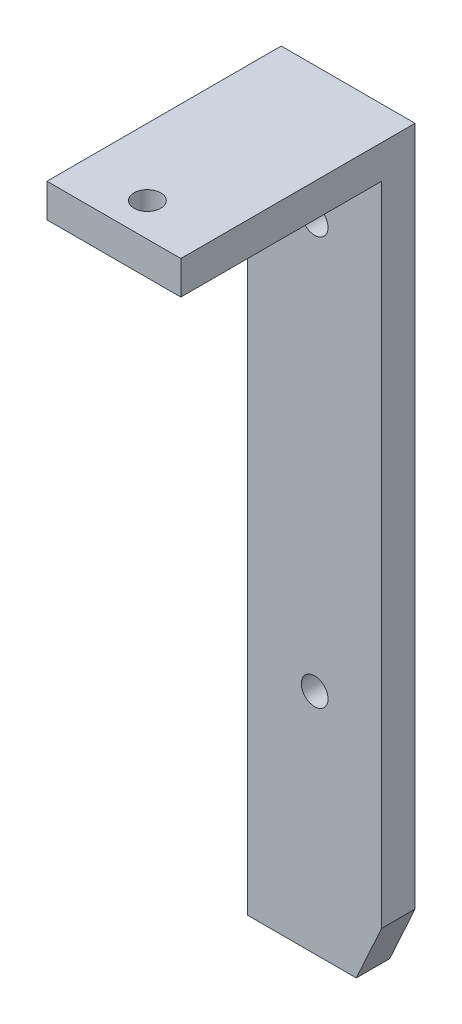
ISO-10303-21;
HEADER;
FILE_DESCRIPTION(('STEP AP214'),'2;1');
FILE_NAME('part.step','',(''),(''),'','','');
FILE_SCHEMA(('AUTOMOTIVE_DESIGN { 1 0 10303 214 1 1 1 1 }'));
ENDSEC;
DATA;
#1=APPLICATION_CONTEXT('core data for automotive mechanical design processes');
#2=APPLICATION_PROTOCOL_DEFINITION('international standard','automotive_design',2000,#1);
#3=PRODUCT_CONTEXT('',#1,'mechanical');
#4=PRODUCT('Part','Part','',(#3));
#5=PRODUCT_RELATED_PRODUCT_CATEGORY('part','',(#4));
#6=PRODUCT_DEFINITION_FORMATION('','',#4);
#7=PRODUCT_DEFINITION_CONTEXT('part definition',#1,'design');
#8=PRODUCT_DEFINITION('design','',#6,#7);
#9=PRODUCT_DEFINITION_SHAPE('','',#8);
#10=(LENGTH_UNIT() NAMED_UNIT(*) SI_UNIT(.MILLI.,.METRE.));
#11=(NAMED_UNIT(*) PLANE_ANGLE_UNIT() SI_UNIT($,.RADIAN.));
#12=(NAMED_UNIT(*) SI_UNIT($,.STERADIAN.) SOLID_ANGLE_UNIT());
#13=UNCERTAINTY_MEASURE_WITH_UNIT(LENGTH_MEASURE(1.E-05),#10,'distance_accuracy_value','');
#14=(GEOMETRIC_REPRESENTATION_CONTEXT(3) GLOBAL_UNCERTAINTY_ASSIGNED_CONTEXT((#13)) GLOBAL_UNIT_ASSIGNED_CONTEXT((#10,
#11,#12)) REPRESENTATION_CONTEXT('',''));
#15=CARTESIAN_POINT('',(0.,0.,0.));
#16=DIRECTION('',(0.,0.,1.));
#17=DIRECTION('',(1.,0.,0.));
#18=AXIS2_PLACEMENT_3D('',#15,#16,#17);
#19=CARTESIAN_POINT('',(6.35,69.85,1.5875));
#20=DIRECTION('',(0.,0.,-1.));
#21=DIRECTION('',(-1.,0.,0.));
#22=AXIS2_PLACEMENT_3D('',#19,#20,#21);
#23=PLANE('',#22);
#24=CARTESIAN_POINT('',(0.,21.59,1.5875));
#25=DIRECTION('',(0.,0.,1.));
#26=DIRECTION('',(1.,0.,0.));
#27=AXIS2_PLACEMENT_3D('',#24,#25,#26);
#28=CIRCLE('',#27,1.27);
#29=CARTESIAN_POINT('',(1.27000000000001,21.59,1.5875));
#30=VERTEX_POINT('',#29);
#31=EDGE_CURVE('E160',#30,#30,#28,.T.);
#32=ORIENTED_EDGE('',*,*,#31,.F.);
#33=EDGE_LOOP('',(#32));
#34=FACE_BOUND('',#33,.T.);
#35=CARTESIAN_POINT('',(0.,60.325,1.5875));
#36=DIRECTION('',(0.,0.,1.));
#37=DIRECTION('',(1.,0.,0.));
#38=AXIS2_PLACEMENT_3D('',#35,#36,#37);
#39=CIRCLE('',#38,1.27);
#40=CARTESIAN_POINT('',(1.27,60.325,1.5875));
#41=VERTEX_POINT('',#40);
#42=EDGE_CURVE('E154',#41,#41,#39,.T.);
#43=ORIENTED_EDGE('',*,*,#42,.F.);
#44=EDGE_LOOP('',(#43));
#45=FACE_BOUND('',#44,.T.);
#46=DIRECTION('',(1.,0.,0.));
#47=VECTOR('',#46,1.);
#48=CARTESIAN_POINT('',(6.35,0.,1.5875));
#49=LINE('',#48,#47);
#50=CARTESIAN_POINT('',(-6.35,0.,1.5875));
#51=VERTEX_POINT('',#50);
#52=CARTESIAN_POINT('',(3.95148272282649,0.,1.5875));
#53=VERTEX_POINT('',#52);
#54=EDGE_CURVE('E120',#51,#53,#49,.T.);
#55=ORIENTED_EDGE('',*,*,#54,.T.);
#56=DIRECTION('',(-0.414132590750487,-0.910216566141426,0.));
#57=VECTOR('',#56,1.);
#58=CARTESIAN_POINT('',(3.95148272282649,0.,1.5875));
#59=LINE('',#58,#57);
#60=CARTESIAN_POINT('',(6.35,5.27166952956644,1.5875));
#61=VERTEX_POINT('',#60);
#62=EDGE_CURVE('E51',#61,#53,#59,.T.);
#63=ORIENTED_EDGE('',*,*,#62,.F.);
#64=DIRECTION('',(0.,-1.,0.));
#65=VECTOR('',#64,1.);
#66=CARTESIAN_POINT('',(6.35,69.85,1.5875));
#67=LINE('',#66,#65);
#68=CARTESIAN_POINT('',(6.35,66.675,1.5875));
#69=VERTEX_POINT('',#68);
#70=EDGE_CURVE('E44',#69,#61,#67,.T.);
#71=ORIENTED_EDGE('',*,*,#70,.F.);
#72=DIRECTION('',(1.,0.,0.));
#73=VECTOR('',#72,1.);
#74=CARTESIAN_POINT('',(-6.35,66.675,1.5875));
#75=LINE('',#74,#73);
#76=CARTESIAN_POINT('',(-6.35,66.675,1.5875));
#77=VERTEX_POINT('',#76);
#78=EDGE_CURVE('E58',#77,#69,#75,.T.);
#79=ORIENTED_EDGE('',*,*,#78,.F.);
#80=DIRECTION('',(0.,-1.,0.));
#81=VECTOR('',#80,1.);
#82=CARTESIAN_POINT('',(-6.35,69.85,1.5875));
#83=LINE('',#82,#81);
#84=EDGE_CURVE('E11',#77,#51,#83,.T.);
#85=ORIENTED_EDGE('',*,*,#84,.T.);
#86=EDGE_LOOP('',(#55,#63,#71,#79,#85));
#87=FACE_BOUND('',#86,.T.);
#88=ADVANCED_FACE('F36',(#34,#45,#87),#23,.F.);
#89=CARTESIAN_POINT('',(-6.35,69.85,1.5875));
#90=DIRECTION('',(1.,0.,0.));
#91=DIRECTION('',(0.,0.,-1.));
#92=AXIS2_PLACEMENT_3D('',#89,#90,#91);
#93=PLANE('',#92);
#94=DIRECTION('',(0.,0.,1.));
#95=VECTOR('',#94,1.);
#96=CARTESIAN_POINT('',(-6.35,0.,1.5875));
#97=LINE('',#96,#95);
#98=CARTESIAN_POINT('',(-6.35,0.,-1.5875));
#99=VERTEX_POINT('',#98);
#100=EDGE_CURVE('E123',#99,#51,#97,.T.);
#101=ORIENTED_EDGE('',*,*,#100,.T.);
#102=ORIENTED_EDGE('',*,*,#84,.F.);
#103=DIRECTION('',(0.,0.,-1.));
#104=VECTOR('',#103,1.);
#105=CARTESIAN_POINT('',(-6.35,66.675,20.6375));
#106=LINE('',#105,#104);
#107=CARTESIAN_POINT('',(-6.35,66.675,20.6375));
#108=VERTEX_POINT('',#107);
#109=EDGE_CURVE('E126',#108,#77,#106,.T.);
#110=ORIENTED_EDGE('',*,*,#109,.F.);
#111=DIRECTION('',(0.,-1.,0.));
#112=VECTOR('',#111,1.);
#113=CARTESIAN_POINT('',(-6.35,69.85,20.6375));
#114=LINE('',#113,#112);
#115=CARTESIAN_POINT('',(-6.35,69.85,20.6375));
#116=VERTEX_POINT('',#115);
#117=EDGE_CURVE('E137',#116,#108,#114,.T.);
#118=ORIENTED_EDGE('',*,*,#117,.F.);
#119=DIRECTION('',(0.,0.,1.));
#120=VECTOR('',#119,1.);
#121=CARTESIAN_POINT('',(-6.35,69.85,1.5875));
#122=LINE('',#121,#120);
#123=CARTESIAN_POINT('',(-6.35,69.85,-1.5875));
#124=VERTEX_POINT('',#123);
#125=EDGE_CURVE('E119',#124,#116,#122,.T.);
#126=ORIENTED_EDGE('',*,*,#125,.F.);
#127=DIRECTION('',(0.,-1.,0.));
#128=VECTOR('',#127,1.);
#129=CARTESIAN_POINT('',(-6.35,69.85,-1.5875));
#130=LINE('',#129,#128);
#131=EDGE_CURVE('E112',#124,#99,#130,.T.);
#132=ORIENTED_EDGE('',*,*,#131,.T.);
#133=EDGE_LOOP('',(#101,#102,#110,#118,#126,#132));
#134=FACE_BOUND('',#133,.T.);
#135=ADVANCED_FACE('F38',(#134),#93,.F.);
#136=CARTESIAN_POINT('',(6.35,69.85,1.5875));
#137=DIRECTION('',(-1.,0.,0.));
#138=DIRECTION('',(0.,0.,1.));
#139=AXIS2_PLACEMENT_3D('',#136,#137,#138);
#140=PLANE('',#139);
#141=ORIENTED_EDGE('',*,*,#70,.T.);
#142=DIRECTION('',(0.,0.,1.));
#143=VECTOR('',#142,1.);
#144=CARTESIAN_POINT('',(6.35,5.27166952956644,-1.5875));
#145=LINE('',#144,#143);
#146=CARTESIAN_POINT('',(6.35,5.27166952956644,-1.5875));
#147=VERTEX_POINT('',#146);
#148=EDGE_CURVE('E95',#147,#61,#145,.T.);
#149=ORIENTED_EDGE('',*,*,#148,.F.);
#150=DIRECTION('',(0.,-1.,0.));
#151=VECTOR('',#150,1.);
#152=CARTESIAN_POINT('',(6.35,69.85,-1.5875));
#153=LINE('',#152,#151);
#154=CARTESIAN_POINT('',(6.35,69.85,-1.5875));
#155=VERTEX_POINT('',#154);
#156=EDGE_CURVE('E105',#155,#147,#153,.T.);
#157=ORIENTED_EDGE('',*,*,#156,.F.);
#158=DIRECTION('',(0.,0.,-1.));
#159=VECTOR('',#158,1.);
#160=CARTESIAN_POINT('',(6.35,69.85,1.5875));
#161=LINE('',#160,#159);
#162=CARTESIAN_POINT('',(6.35,69.85,20.6375));
#163=VERTEX_POINT('',#162);
#164=EDGE_CURVE('E128',#163,#155,#161,.T.);
#165=ORIENTED_EDGE('',*,*,#164,.F.);
#166=DIRECTION('',(0.,1.,0.));
#167=VECTOR('',#166,1.);
#168=CARTESIAN_POINT('',(6.35,69.85,20.6375));
#169=LINE('',#168,#167);
#170=CARTESIAN_POINT('',(6.35,66.675,20.6375));
#171=VERTEX_POINT('',#170);
#172=EDGE_CURVE('E141',#171,#163,#169,.T.);
#173=ORIENTED_EDGE('',*,*,#172,.F.);
#174=DIRECTION('',(0.,0.,-1.));
#175=VECTOR('',#174,1.);
#176=CARTESIAN_POINT('',(6.35,66.675,20.6375));
#177=LINE('',#176,#175);
#178=EDGE_CURVE('E133',#171,#69,#177,.T.);
#179=ORIENTED_EDGE('',*,*,#178,.T.);
#180=EDGE_LOOP('',(#141,#149,#157,#165,#173,#179));
#181=FACE_BOUND('',#180,.T.);
#182=ADVANCED_FACE('F104',(#181),#140,.F.);
#183=CARTESIAN_POINT('',(6.35,69.85,-1.5875));
#184=DIRECTION('',(0.,0.,1.));
#185=DIRECTION('',(1.,0.,0.));
#186=AXIS2_PLACEMENT_3D('',#183,#184,#185);
#187=PLANE('',#186);
#188=CARTESIAN_POINT('',(0.,21.59,-1.5875));
#189=DIRECTION('',(0.,0.,1.));
#190=DIRECTION('',(1.,0.,0.));
#191=AXIS2_PLACEMENT_3D('',#188,#189,#190);
#192=CIRCLE('',#191,1.27);
#193=CARTESIAN_POINT('',(1.27000000000001,21.59,-1.5875));
#194=VERTEX_POINT('',#193);
#195=EDGE_CURVE('E151',#194,#194,#192,.T.);
#196=ORIENTED_EDGE('',*,*,#195,.T.);
#197=EDGE_LOOP('',(#196));
#198=FACE_BOUND('',#197,.T.);
#199=CARTESIAN_POINT('',(0.,60.325,-1.5875));
#200=DIRECTION('',(0.,0.,1.));
#201=DIRECTION('',(1.,0.,0.));
#202=AXIS2_PLACEMENT_3D('',#199,#200,#201);
#203=CIRCLE('',#202,1.27);
#204=CARTESIAN_POINT('',(1.27,60.325,-1.5875));
#205=VERTEX_POINT('',#204);
#206=EDGE_CURVE('E157',#205,#205,#203,.T.);
#207=ORIENTED_EDGE('',*,*,#206,.T.);
#208=EDGE_LOOP('',(#207));
#209=FACE_BOUND('',#208,.T.);
#210=ORIENTED_EDGE('',*,*,#156,.T.);
#211=DIRECTION('',(-0.414132590750487,-0.910216566141426,0.));
#212=VECTOR('',#211,1.);
#213=CARTESIAN_POINT('',(3.95148272282649,0.,-1.5875));
#214=LINE('',#213,#212);
#215=CARTESIAN_POINT('',(3.95148272282649,0.,-1.5875));
#216=VERTEX_POINT('',#215);
#217=EDGE_CURVE('E92',#147,#216,#214,.T.);
#218=ORIENTED_EDGE('',*,*,#217,.T.);
#219=DIRECTION('',(-1.,0.,0.));
#220=VECTOR('',#219,1.);
#221=CARTESIAN_POINT('',(6.35,0.,-1.5875));
#222=LINE('',#221,#220);
#223=EDGE_CURVE('E117',#216,#99,#222,.T.);
#224=ORIENTED_EDGE('',*,*,#223,.T.);
#225=ORIENTED_EDGE('',*,*,#131,.F.);
#226=DIRECTION('',(-1.,0.,0.));
#227=VECTOR('',#226,1.);
#228=CARTESIAN_POINT('',(6.35,69.85,-1.5875));
#229=LINE('',#228,#227);
#230=EDGE_CURVE('E111',#155,#124,#229,.T.);
#231=ORIENTED_EDGE('',*,*,#230,.F.);
#232=EDGE_LOOP('',(#210,#218,#224,#225,#231));
#233=FACE_BOUND('',#232,.T.);
#234=ADVANCED_FACE('F109',(#198,#209,#233),#187,.F.);
#235=CARTESIAN_POINT('',(0.,69.85,0.));
#236=DIRECTION('',(0.,1.,0.));
#237=DIRECTION('',(0.,0.,1.));
#238=AXIS2_PLACEMENT_3D('',#235,#236,#237);
#239=PLANE('',#238);
#240=CARTESIAN_POINT('',(0.,69.85,17.4625));
#241=DIRECTION('',(0.,-1.,0.));
#242=DIRECTION('',(0.,0.,-1.));
#243=AXIS2_PLACEMENT_3D('',#240,#241,#242);
#244=CIRCLE('',#243,1.27);
#245=CARTESIAN_POINT('',(0.,69.85,16.1925));
#246=VERTEX_POINT('',#245);
#247=EDGE_CURVE('E138',#246,#246,#244,.T.);
#248=ORIENTED_EDGE('',*,*,#247,.T.);
#249=EDGE_LOOP('',(#248));
#250=FACE_BOUND('',#249,.T.);
#251=ORIENTED_EDGE('',*,*,#125,.T.);
#252=DIRECTION('',(-1.,0.,0.));
#253=VECTOR('',#252,1.);
#254=CARTESIAN_POINT('',(-6.35,69.85,20.6375));
#255=LINE('',#254,#253);
#256=EDGE_CURVE('E135',#163,#116,#255,.T.);
#257=ORIENTED_EDGE('',*,*,#256,.F.);
#258=ORIENTED_EDGE('',*,*,#164,.T.);
#259=ORIENTED_EDGE('',*,*,#230,.T.);
#260=EDGE_LOOP('',(#251,#257,#258,#259));
#261=FACE_BOUND('',#260,.T.);
#262=ADVANCED_FACE('F182',(#250,#261),#239,.T.);
#263=CARTESIAN_POINT('',(0.,0.,0.));
#264=DIRECTION('',(0.,1.,0.));
#265=DIRECTION('',(0.,0.,1.));
#266=AXIS2_PLACEMENT_3D('',#263,#264,#265);
#267=PLANE('',#266);
#268=ORIENTED_EDGE('',*,*,#223,.F.);
#269=DIRECTION('',(0.,0.,1.));
#270=VECTOR('',#269,1.);
#271=CARTESIAN_POINT('',(3.95148272282649,0.,-1.5875));
#272=LINE('',#271,#270);
#273=EDGE_CURVE('E96',#216,#53,#272,.T.);
#274=ORIENTED_EDGE('',*,*,#273,.T.);
#275=ORIENTED_EDGE('',*,*,#54,.F.);
#276=ORIENTED_EDGE('',*,*,#100,.F.);
#277=EDGE_LOOP('',(#268,#274,#275,#276));
#278=FACE_BOUND('',#277,.T.);
#279=ADVANCED_FACE('F168',(#278),#267,.F.);
#280=CARTESIAN_POINT('',(-6.35,66.675,20.6375));
#281=DIRECTION('',(0.,1.,0.));
#282=DIRECTION('',(0.,0.,1.));
#283=AXIS2_PLACEMENT_3D('',#280,#281,#282);
#284=PLANE('',#283);
#285=CARTESIAN_POINT('',(0.,66.675,17.4625));
#286=DIRECTION('',(0.,-1.,0.));
#287=DIRECTION('',(0.,0.,-1.));
#288=AXIS2_PLACEMENT_3D('',#285,#286,#287);
#289=CIRCLE('',#288,1.27);
#290=CARTESIAN_POINT('',(0.,66.675,16.1925));
#291=VERTEX_POINT('',#290);
#292=EDGE_CURVE('E148',#291,#291,#289,.T.);
#293=ORIENTED_EDGE('',*,*,#292,.F.);
#294=EDGE_LOOP('',(#293));
#295=FACE_BOUND('',#294,.T.);
#296=ORIENTED_EDGE('',*,*,#78,.T.);
#297=ORIENTED_EDGE('',*,*,#178,.F.);
#298=DIRECTION('',(1.,0.,0.));
#299=VECTOR('',#298,1.);
#300=CARTESIAN_POINT('',(-6.35,66.675,20.6375));
#301=LINE('',#300,#299);
#302=EDGE_CURVE('E144',#108,#171,#301,.T.);
#303=ORIENTED_EDGE('',*,*,#302,.F.);
#304=ORIENTED_EDGE('',*,*,#109,.T.);
#305=EDGE_LOOP('',(#296,#297,#303,#304));
#306=FACE_BOUND('',#305,.T.);
#307=ADVANCED_FACE('F174',(#295,#306),#284,.F.);
#308=CARTESIAN_POINT('',(0.,0.,20.6375));
#309=DIRECTION('',(0.,0.,1.));
#310=DIRECTION('',(1.,0.,0.));
#311=AXIS2_PLACEMENT_3D('',#308,#309,#310);
#312=PLANE('',#311);
#313=ORIENTED_EDGE('',*,*,#117,.T.);
#314=ORIENTED_EDGE('',*,*,#302,.T.);
#315=ORIENTED_EDGE('',*,*,#172,.T.);
#316=ORIENTED_EDGE('',*,*,#256,.T.);
#317=EDGE_LOOP('',(#313,#314,#315,#316));
#318=FACE_BOUND('',#317,.T.);
#319=ADVANCED_FACE('F178',(#318),#312,.T.);
#320=CARTESIAN_POINT('',(0.,69.85,17.4625));
#321=DIRECTION('',(0.,-1.,0.));
#322=DIRECTION('',(0.,0.,-1.));
#323=AXIS2_PLACEMENT_3D('',#320,#321,#322);
#324=CYLINDRICAL_SURFACE('',#323,1.27);
#325=ORIENTED_EDGE('',*,*,#247,.F.);
#326=EDGE_LOOP('',(#325));
#327=FACE_BOUND('',#326,.T.);
#328=ORIENTED_EDGE('',*,*,#292,.T.);
#329=EDGE_LOOP('',(#328));
#330=FACE_BOUND('',#329,.T.);
#331=ADVANCED_FACE('F246',(#327,#330),#324,.F.);
#332=CARTESIAN_POINT('',(0.,60.325,-1.5875));
#333=DIRECTION('',(0.,0.,1.));
#334=DIRECTION('',(1.,0.,0.));
#335=AXIS2_PLACEMENT_3D('',#332,#333,#334);
#336=CYLINDRICAL_SURFACE('',#335,1.27);
#337=ORIENTED_EDGE('',*,*,#206,.F.);
#338=EDGE_LOOP('',(#337));
#339=FACE_BOUND('',#338,.T.);
#340=ORIENTED_EDGE('',*,*,#42,.T.);
#341=EDGE_LOOP('',(#340));
#342=FACE_BOUND('',#341,.T.);
#343=ADVANCED_FACE('F239',(#339,#342),#336,.F.);
#344=CARTESIAN_POINT('',(0.,21.59,-1.5875));
#345=DIRECTION('',(0.,0.,1.));
#346=DIRECTION('',(1.,0.,0.));
#347=AXIS2_PLACEMENT_3D('',#344,#345,#346);
#348=CYLINDRICAL_SURFACE('',#347,1.27);
#349=ORIENTED_EDGE('',*,*,#195,.F.);
#350=EDGE_LOOP('',(#349));
#351=FACE_BOUND('',#350,.T.);
#352=ORIENTED_EDGE('',*,*,#31,.T.);
#353=EDGE_LOOP('',(#352));
#354=FACE_BOUND('',#353,.T.);
#355=ADVANCED_FACE('F229',(#351,#354),#348,.F.);
#356=CARTESIAN_POINT('',(3.95148272282649,0.,-1.5875));
#357=DIRECTION('',(-0.910216566141426,0.414132590750487,0.));
#358=DIRECTION('',(-0.414132590750487,-0.910216566141426,0.));
#359=AXIS2_PLACEMENT_3D('',#356,#357,#358);
#360=PLANE('',#359);
#361=ORIENTED_EDGE('',*,*,#62,.T.);
#362=ORIENTED_EDGE('',*,*,#273,.F.);
#363=ORIENTED_EDGE('',*,*,#217,.F.);
#364=ORIENTED_EDGE('',*,*,#148,.T.);
#365=EDGE_LOOP('',(#361,#362,#363,#364));
#366=FACE_BOUND('',#365,.T.);
#367=ADVANCED_FACE('F94',(#366),#360,.F.);
#368=CLOSED_SHELL('',(#88,#135,#182,#234,#262,#279,#307,#319,#331,#343,#355,#367));
#369=MANIFOLD_SOLID_BREP('B2',#368);
#370=ADVANCED_BREP_SHAPE_REPRESENTATION('',(#18,#369),#14);
#371=SHAPE_DEFINITION_REPRESENTATION(#9,#370);
ENDSEC;
END-ISO-10303-21;
